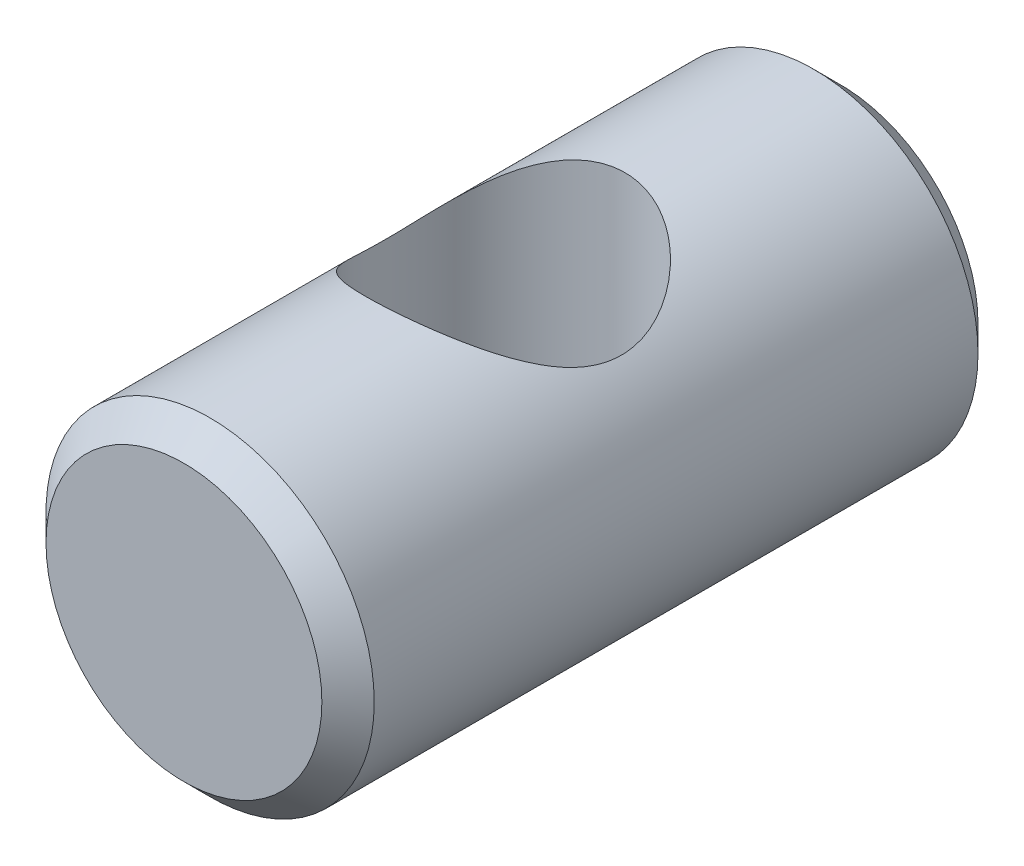
ISO-10303-21;
HEADER;
FILE_DESCRIPTION(('STEP AP214'),'2;1');
FILE_NAME('part.step','',(''),(''),'','','');
FILE_SCHEMA(('AUTOMOTIVE_DESIGN { 1 0 10303 214 1 1 1 1 }'));
ENDSEC;
DATA;
#1=APPLICATION_CONTEXT('core data for automotive mechanical design processes');
#2=APPLICATION_PROTOCOL_DEFINITION('international standard','automotive_design',2000,#1);
#3=PRODUCT_CONTEXT('',#1,'mechanical');
#4=PRODUCT('Part','Part','',(#3));
#5=PRODUCT_RELATED_PRODUCT_CATEGORY('part','',(#4));
#6=PRODUCT_DEFINITION_FORMATION('','',#4);
#7=PRODUCT_DEFINITION_CONTEXT('part definition',#1,'design');
#8=PRODUCT_DEFINITION('design','',#6,#7);
#9=PRODUCT_DEFINITION_SHAPE('','',#8);
#10=(LENGTH_UNIT() NAMED_UNIT(*) SI_UNIT(.MILLI.,.METRE.));
#11=(NAMED_UNIT(*) PLANE_ANGLE_UNIT() SI_UNIT($,.RADIAN.));
#12=(NAMED_UNIT(*) SI_UNIT($,.STERADIAN.) SOLID_ANGLE_UNIT());
#13=UNCERTAINTY_MEASURE_WITH_UNIT(LENGTH_MEASURE(1.E-05),#10,'distance_accuracy_value','');
#14=(GEOMETRIC_REPRESENTATION_CONTEXT(3) GLOBAL_UNCERTAINTY_ASSIGNED_CONTEXT((#13)) GLOBAL_UNIT_ASSIGNED_CONTEXT((#10,
#11,#12)) REPRESENTATION_CONTEXT('',''));
#15=CARTESIAN_POINT('',(0.,0.,0.));
#16=DIRECTION('',(0.,0.,1.));
#17=DIRECTION('',(1.,0.,0.));
#18=AXIS2_PLACEMENT_3D('',#15,#16,#17);
#19=CARTESIAN_POINT('',(0.,0.,9.525));
#20=DIRECTION('',(0.,0.,-1.));
#21=DIRECTION('',(-1.,0.,0.));
#22=AXIS2_PLACEMENT_3D('',#19,#20,#21);
#23=CYLINDRICAL_SURFACE('',#22,4.765);
#24=CARTESIAN_POINT('',(0.,0.,8.76500000000001));
#25=DIRECTION('',(0.,0.,1.));
#26=DIRECTION('',(1.,0.,0.));
#27=AXIS2_PLACEMENT_3D('',#24,#25,#26);
#28=CIRCLE('',#27,4.765);
#29=CARTESIAN_POINT('',(4.765,0.,8.76500000000001));
#30=VERTEX_POINT('',#29);
#31=EDGE_CURVE('E45',#30,#30,#28,.F.);
#32=ORIENTED_EDGE('',*,*,#31,.T.);
#33=EDGE_LOOP('',(#32));
#34=FACE_BOUND('',#33,.T.);
#35=CARTESIAN_POINT('',(0.,0.,-8.76499999999999));
#36=DIRECTION('',(0.,0.,1.));
#37=DIRECTION('',(1.,0.,0.));
#38=AXIS2_PLACEMENT_3D('',#35,#36,#37);
#39=CIRCLE('',#38,4.765);
#40=CARTESIAN_POINT('',(4.765,0.,-8.76499999999999));
#41=VERTEX_POINT('',#40);
#42=EDGE_CURVE('E49',#41,#41,#39,.T.);
#43=ORIENTED_EDGE('',*,*,#42,.T.);
#44=EDGE_LOOP('',(#43));
#45=FACE_BOUND('',#44,.T.);
#46=CARTESIAN_POINT('',(0.,-4.765,-3.42087708051605));
#47=CARTESIAN_POINT('',(-0.0833627581168181,-4.7649997101109,-3.42696899134863));
#48=CARTESIAN_POINT('',(-0.166953392424251,-4.76280757869707,-3.43001003086424));
#49=CARTESIAN_POINT('',(-0.333933182408652,-4.75402028790231,-3.4299899120654));
#50=CARTESIAN_POINT('',(-0.41732223719261,-4.74742325494959,-3.42692615604904));
#51=CARTESIAN_POINT('',(-0.583312250165056,-4.72989865727235,-3.41478160746824));
#52=CARTESIAN_POINT('',(-0.665912068503747,-4.71896558414041,-3.40569315136156));
#53=CARTESIAN_POINT('',(-0.829610597514772,-4.69295834085159,-3.38168739143667));
#54=CARTESIAN_POINT('',(-0.91070865358331,-4.67788240819801,-3.36676760565251));
#55=CARTESIAN_POINT('',(-1.15000632689336,-4.62699847385246,-3.31382161536754));
#56=CARTESIAN_POINT('',(-1.30524951697123,-4.58542013528299,-3.26752778272676));
#57=CARTESIAN_POINT('',(-1.60411463212557,-4.48962808746058,-3.15544383432779));
#58=CARTESIAN_POINT('',(-1.74773682156028,-4.43541466574349,-3.08965416222603));
#59=CARTESIAN_POINT('',(-2.03259497643689,-4.31273538578719,-2.93522566350036));
#60=CARTESIAN_POINT('',(-2.17272279857911,-4.24347672491827,-2.84518090003159));
#61=CARTESIAN_POINT('',(-2.43631552731587,-4.09784606286129,-2.64803347355049));
#62=CARTESIAN_POINT('',(-2.55976291960052,-4.02146672501527,-2.54091313456509));
#63=CARTESIAN_POINT('',(-2.81327393100644,-3.84950291536883,-2.28757037498761));
#64=CARTESIAN_POINT('',(-2.93940806717613,-3.75321839663728,-2.13784494064544));
#65=CARTESIAN_POINT('',(-3.10885207016274,-3.61188607024724,-1.89774924473951));
#66=CARTESIAN_POINT('',(-3.16205944901992,-3.56527135977744,-1.81509327318893));
#67=CARTESIAN_POINT('',(-3.26165283895997,-3.47438917550769,-1.64456461914389));
#68=CARTESIAN_POINT('',(-3.30804141803447,-3.43012082209569,-1.55669391813204));
#69=CARTESIAN_POINT('',(-3.41144333221737,-3.32784018306176,-1.33801732923479));
#70=CARTESIAN_POINT('',(-3.46485738281701,-3.27176419567389,-1.20454764001565));
#71=CARTESIAN_POINT('',(-3.55539465585279,-3.1731532714438,-0.92756721927326));
#72=CARTESIAN_POINT('',(-3.59255605597934,-3.13058666617785,-0.784080947165173));
#73=CARTESIAN_POINT('',(-3.64343651296181,-3.07113542283653,-0.514646140223209));
#74=CARTESIAN_POINT('',(-3.66010628533956,-3.05107413064414,-0.389980532152303));
#75=CARTESIAN_POINT('',(-3.67954153570878,-3.02761567970702,-0.13805144197163));
#76=CARTESIAN_POINT('',(-3.68232117171679,-3.02420155283186,-0.0107907379518655));
#77=CARTESIAN_POINT('',(-3.67376621747767,-3.03458366659267,0.242449329866106));
#78=CARTESIAN_POINT('',(-3.66243797397314,-3.04837216824954,0.368429244158408));
#79=CARTESIAN_POINT('',(-3.62657095184853,-3.09094772918142,0.615927376424316));
#80=CARTESIAN_POINT('',(-3.60201250089043,-3.11975712134959,0.737438661719832));
#81=CARTESIAN_POINT('',(-3.52797021750045,-3.20358122773375,1.02486117239319));
#82=CARTESIAN_POINT('',(-3.47231020523667,-3.26453704351351,1.18741075414518));
#83=CARTESIAN_POINT('',(-3.34017866781708,-3.39961296516166,1.498121783823));
#84=CARTESIAN_POINT('',(-3.2636446149314,-3.47377238661047,1.64623815847782));
#85=CARTESIAN_POINT('',(-3.12200897105521,-3.60054284241464,1.87825971607124));
#86=CARTESIAN_POINT('',(-3.06234750531042,-3.65156363596669,1.9664324955114));
#87=CARTESIAN_POINT('',(-2.93536296354977,-3.75440484501345,2.13658829521524));
#88=CARTESIAN_POINT('',(-2.86803758566651,-3.80622549668558,2.21856944344932));
#89=CARTESIAN_POINT('',(-2.65493557738645,-3.96070606463684,2.4548169203279));
#90=CARTESIAN_POINT('',(-2.4978237985218,-4.06258137631192,2.59972905493882));
#91=CARTESIAN_POINT('',(-2.18575837138569,-4.23718725327564,2.83706621766583));
#92=CARTESIAN_POINT('',(-2.03548298499758,-4.31186637762032,2.93424360521689));
#93=CARTESIAN_POINT('',(-1.71702572980925,-4.44824656330391,3.10568912436018));
#94=CARTESIAN_POINT('',(-1.54887024912961,-4.50996636079323,3.17999040299218));
#95=CARTESIAN_POINT('',(-1.22389848309853,-4.60778480850806,3.29263516387729));
#96=CARTESIAN_POINT('',(-1.06910753325384,-4.64632732736096,3.33468022800881));
#97=CARTESIAN_POINT('',(-0.752190984217971,-4.70801774696666,3.39687013419293));
#98=CARTESIAN_POINT('',(-0.590069112764688,-4.73117337991453,3.4170259792185));
#99=CARTESIAN_POINT('',(-0.262598143568304,-4.7606051003247,3.43390286080124));
#100=CARTESIAN_POINT('',(-0.0972412962651654,-4.76683385814853,3.43055828056669));
#101=CARTESIAN_POINT('',(0.231024129353291,-4.76222706928004,3.40010195996678));
#102=CARTESIAN_POINT('',(0.393932420256084,-4.75138953488968,3.37298745129903));
#103=CARTESIAN_POINT('',(0.705514268669747,-4.71498049061455,3.2979508357131));
#104=CARTESIAN_POINT('',(0.854498752183593,-4.69006694126301,3.25098003249397));
#105=CARTESIAN_POINT('',(1.14256413370517,-4.62833634686259,3.13840780618742));
#106=CARTESIAN_POINT('',(1.28164310390504,-4.59151699239254,3.07280276883643));
#107=CARTESIAN_POINT('',(1.5605913242394,-4.50478911028579,2.91796402171938));
#108=CARTESIAN_POINT('',(1.6992420339739,-4.45396042558585,2.82706121692328));
#109=CARTESIAN_POINT('',(1.96045324775841,-4.34533105232054,2.62789389216064));
#110=CARTESIAN_POINT('',(2.08299871660834,-4.28752394420402,2.51961335554432));
#111=CARTESIAN_POINT('',(2.33061071233595,-4.15886196775128,2.26753986981794));
#112=CARTESIAN_POINT('',(2.45245602746959,-4.08747815085455,2.12084350362776));
#113=CARTESIAN_POINT('',(2.67091966387116,-3.94818744226299,1.80818256348861));
#114=CARTESIAN_POINT('',(2.76753692468301,-3.88028069682256,1.64221717999394));
#115=CARTESIAN_POINT('',(2.91829752704228,-3.76775877390235,1.32363316444147));
#116=CARTESIAN_POINT('',(2.97693831230802,-3.72114907301219,1.17388770573105));
#117=CARTESIAN_POINT('',(3.04915600293589,-3.66180847873486,0.941826581338293));
#118=CARTESIAN_POINT('',(3.0706008978109,-3.64379412637323,0.863255129060434));
#119=CARTESIAN_POINT('',(3.10797188341904,-3.61197174564401,0.703992654043788));
#120=CARTESIAN_POINT('',(3.12390068817333,-3.59816164910817,0.623302694735672));
#121=CARTESIAN_POINT('',(3.15010468685879,-3.57524455910332,0.459495462666018));
#122=CARTESIAN_POINT('',(3.16032158062367,-3.5661861203942,0.376361962516616));
#123=CARTESIAN_POINT('',(3.17464168800661,-3.55344451616001,0.209195138832912));
#124=CARTESIAN_POINT('',(3.17874788699032,-3.54975872585817,0.125162274904956));
#125=CARTESIAN_POINT('',(3.18076053743013,-3.54795587812489,-0.0430393452037649));
#126=CARTESIAN_POINT('',(3.17866722999484,-3.54983860412504,-0.127208095972433));
#127=CARTESIAN_POINT('',(3.16833758034576,-3.55905933774995,-0.294840628996076));
#128=CARTESIAN_POINT('',(3.16010150131517,-3.56639711165655,-0.378304441298765));
#129=CARTESIAN_POINT('',(3.129430196119,-3.59341005189328,-0.604314657609784));
#130=CARTESIAN_POINT('',(3.10101793603989,-3.61818171011667,-0.745494317394035));
#131=CARTESIAN_POINT('',(3.02771937958645,-3.67972750014127,-1.02069983126741));
#132=CARTESIAN_POINT('',(2.98281650470617,-3.71651370639189,-1.1547183301723));
#133=CARTESIAN_POINT('',(2.8560768918245,-3.8153502491925,-1.46853642894096));
#134=CARTESIAN_POINT('',(2.76664814536404,-3.88152734494911,-1.64398166227299));
#135=CARTESIAN_POINT('',(2.56077346334119,-4.02033820070584,-1.97551522842484));
#136=CARTESIAN_POINT('',(2.44428083509274,-4.09298298410994,-2.13156938380249));
#137=CARTESIAN_POINT('',(2.18450650401399,-4.2373970566927,-2.42421216807333));
#138=CARTESIAN_POINT('',(2.04090097393914,-4.30914323590253,-2.56052605726515));
#139=CARTESIAN_POINT('',(1.72973058522059,-4.44318432752426,-2.80802181758102));
#140=CARTESIAN_POINT('',(1.56219804304704,-4.50549175797245,-2.91923707314102));
#141=CARTESIAN_POINT('',(1.23969583506405,-4.60338031575656,-3.09396462152008));
#142=CARTESIAN_POINT('',(1.08834922542924,-4.64178783933997,-3.16252149709775));
#143=CARTESIAN_POINT('',(0.85338781071092,-4.68864069192958,-3.24875451241662));
#144=CARTESIAN_POINT('',(0.773800863355168,-4.70245945854321,-3.27471971164357));
#145=CARTESIAN_POINT('',(0.612411306870997,-4.72618391319332,-3.32087000112459));
#146=CARTESIAN_POINT('',(0.530609679466058,-4.73609130567107,-3.34105760799584));
#147=CARTESIAN_POINT('',(0.374335243630177,-4.75084997254152,-3.37353939001354));
#148=CARTESIAN_POINT('',(0.300030947704158,-4.75613339853629,-3.38645258471521));
#149=CARTESIAN_POINT('',(0.150546671086999,-4.76320900575073,-3.40736829831093));
#150=CARTESIAN_POINT('',(0.0753664637160969,-4.76500026208246,-3.41536951590209));
#151=CARTESIAN_POINT('',(0.,-4.765,-3.42087708051605));
#152=B_SPLINE_CURVE_WITH_KNOTS('',3,(#46,#47,#48,#49,#50,#51,#52,#53,#54,#55,#56,#57,#58,#59,
#60,#61,#62,#63,#64,#65,#66,#67,#68,#69,#70,#71,#72,#73,#74,#75,#76,#77,#78,#79,#80,#81,#82,#83,
#84,#85,#86,#87,#88,#89,#90,#91,#92,#93,#94,#95,#96,#97,#98,#99,#100,#101,#102,#103,#104,#105,
#106,#107,#108,#109,#110,#111,#112,#113,#114,#115,#116,#117,#118,#119,#120,#121,#122,#123,#124,
#125,#126,#127,#128,#129,#130,#131,#132,#133,#134,#135,#136,#137,#138,#139,#140,#141,#142,#143,
#144,#145,#146,#147,#148,#149,#150,#151),.UNSPECIFIED.,.T.,.F.,(4,2,2,2,2,2,2,2,2,2,2,2,2,2,2,2,
2,2,2,2,2,2,2,2,2,2,2,2,2,2,2,2,2,2,2,2,2,2,2,2,2,2,2,2,2,2,2,2,2,2,2,2,4),(0.,
0.250678148817341,0.501462988541287,0.752567445437252,1.00377889552888,1.50309474088369,
2.00239922444642,2.54160992918404,3.08138247258981,3.73300244855075,4.05909733145616,
4.38506908912952,4.84654436743379,5.30692973453839,5.68734604359481,6.06737452056514,
6.44723209503533,6.82765605484285,7.37157480546313,7.91714109472133,8.27090631470675,
8.62477807035776,9.33119791439566,9.91077027397039,10.4894988486046,10.9822712500665,
11.4747958366297,11.9686961727678,12.4626540373564,12.9352342359093,13.4079061579591,
13.9261848288361,14.4449439577642,15.0533142145202,15.6617100398796,16.1619385675779,
16.4119146790501,16.6617676221917,16.9141262556176,17.1663615593023,17.4185870532858,
17.6708017414467,18.1072101440206,18.5440584873629,19.1640002904501,19.7850197135797,
20.4139885307568,21.0421157411608,21.5513660687497,21.8056438515067,22.059810706191,
22.2863833912941,22.5130160751694),.UNSPECIFIED.);
#153=CARTESIAN_POINT('',(0.,-4.765,-3.42087708051605));
#154=VERTEX_POINT('',#153);
#155=EDGE_CURVE('E58',#154,#154,#152,.T.);
#156=ORIENTED_EDGE('',*,*,#155,.T.);
#157=EDGE_LOOP('',(#156));
#158=FACE_BOUND('',#157,.T.);
#159=CARTESIAN_POINT('',(-0.25,4.75843724346555,3.43));
#160=CARTESIAN_POINT('',(-0.422180009069406,4.749390618167,3.42999980483541));
#161=CARTESIAN_POINT('',(-0.59386282730199,4.73091871113112,3.41695856293195));
#162=CARTESIAN_POINT('',(-0.930629104770302,4.67635636796384,3.36610979440147));
#163=CARTESIAN_POINT('',(-1.09570851357914,4.64025529237457,3.32828730721862));
#164=CARTESIAN_POINT('',(-1.41392411864396,4.55336447971862,3.23075051942857));
#165=CARTESIAN_POINT('',(-1.56712334101048,4.5026601113221,3.17116292636266));
#166=CARTESIAN_POINT('',(-1.85998836726663,4.38979766700268,3.03299834240104));
#167=CARTESIAN_POINT('',(-1.99965414606241,4.32763956984278,2.95442131629586));
#168=CARTESIAN_POINT('',(-2.27820698899914,4.18828982189439,2.77162910883962));
#169=CARTESIAN_POINT('',(-2.41542819149111,4.11020218068904,2.66557505303866));
#170=CARTESIAN_POINT('',(-2.67111072919315,3.94883137284482,2.43572487373919));
#171=CARTESIAN_POINT('',(-2.78953546002451,3.86553849846079,2.31189500490524));
#172=CARTESIAN_POINT('',(-2.96344629098398,3.732292646302,2.10063521621267));
#173=CARTESIAN_POINT('',(-3.02522112465854,3.68226630299909,2.01833701427756));
#174=CARTESIAN_POINT('',(-3.14150590868554,3.58357003530251,1.84790207991889));
#175=CARTESIAN_POINT('',(-3.1960131207988,3.5349006275963,1.7597631654945));
#176=CARTESIAN_POINT('',(-3.29731229261899,3.44060115304685,1.57784833521895));
#177=CARTESIAN_POINT('',(-3.34411822611588,3.39496567295495,1.48408305992192));
#178=CARTESIAN_POINT('',(-3.42959137880208,3.30859742398812,1.29083456033672));
#179=CARTESIAN_POINT('',(-3.46826509160405,3.2678607546062,1.19135597958454));
#180=CARTESIAN_POINT('',(-3.54347659526858,3.18632211811376,0.966712328692861));
#181=CARTESIAN_POINT('',(-3.57812346664731,3.14705996480953,0.840323998552468));
#182=CARTESIAN_POINT('',(-3.63302442402354,3.08352956814293,0.580976208361932));
#183=CARTESIAN_POINT('',(-3.65331272726122,3.05922569654856,0.448033183521057));
#184=CARTESIAN_POINT('',(-3.67812283683354,3.02936636632518,0.177337549423231));
#185=CARTESIAN_POINT('',(-3.68251233934075,3.02396824643502,0.0395541719109347));
#186=CARTESIAN_POINT('',(-3.67470644643728,3.03344305810687,-0.234875874606968));
#187=CARTESIAN_POINT('',(-3.66249943392474,3.04833018879986,-0.37152167996018));
#188=CARTESIAN_POINT('',(-3.62015799382368,3.09852315491188,-0.655828380639309));
#189=CARTESIAN_POINT('',(-3.58799174144691,3.13612809889826,-0.802759414360211));
#190=CARTESIAN_POINT('',(-3.50660899556505,3.22685391573891,-1.08690765852793));
#191=CARTESIAN_POINT('',(-3.45734815065714,3.28001509196861,-1.22409847190397));
#192=CARTESIAN_POINT('',(-3.35999029035731,3.37921222953507,-1.45031682658415));
#193=CARTESIAN_POINT('',(-3.31552748835515,3.42299124550292,-1.54196683547208));
#194=CARTESIAN_POINT('',(-3.21937168211258,3.51357799533849,-1.7198719105116));
#195=CARTESIAN_POINT('',(-3.16767569861283,3.56038697291961,-1.80612473233373));
#196=CARTESIAN_POINT('',(-3.05733519065029,3.655577234441,-1.97327341136436));
#197=CARTESIAN_POINT('',(-2.99868376029761,3.70396004583247,-2.05416381804875));
#198=CARTESIAN_POINT('',(-2.87465956601933,3.80102084509467,-2.21043246978884));
#199=CARTESIAN_POINT('',(-2.80928649472037,3.84969884636825,-2.28581046249783));
#200=CARTESIAN_POINT('',(-2.6702557671566,3.94744940552613,-2.43263894546763));
#201=CARTESIAN_POINT('',(-2.59643405525365,3.99650228404323,-2.50394748039488));
#202=CARTESIAN_POINT('',(-2.44198609531555,4.09270177982323,-2.64020867362414));
#203=CARTESIAN_POINT('',(-2.36135999487914,4.13984843840247,-2.70516146972696));
#204=CARTESIAN_POINT('',(-2.19361254846785,4.2311207520192,-2.82808330517596));
#205=CARTESIAN_POINT('',(-2.10650409604225,4.27525208591359,-2.88606563800173));
#206=CARTESIAN_POINT('',(-1.92594548966524,4.3595756679867,-2.99452956360935));
#207=CARTESIAN_POINT('',(-1.8324951446076,4.39976779737236,-3.04501093021117));
#208=CARTESIAN_POINT('',(-1.58991791011193,4.49465680101692,-3.16160717844564));
#209=CARTESIAN_POINT('',(-1.43688887677842,4.54617300319559,-3.22239703143537));
#210=CARTESIAN_POINT('',(-1.11985321098478,4.63445714602499,-3.3220213557935));
#211=CARTESIAN_POINT('',(-0.955854490731875,4.67123558567514,-3.36087146486794));
#212=CARTESIAN_POINT('',(-0.620041304864638,4.72756501903715,-3.41423360193657));
#213=CARTESIAN_POINT('',(-0.448189976813925,4.74702354164412,-3.42861536060857));
#214=CARTESIAN_POINT('',(-0.10319553205656,4.76701209164517,-3.43119218349009));
#215=CARTESIAN_POINT('',(0.069947271391446,4.76754656888776,-3.41939340455174));
#216=CARTESIAN_POINT('',(0.396800733953032,4.75102741592386,-3.37216085402572));
#217=CARTESIAN_POINT('',(0.550903795546911,4.73547935394817,-3.33884247322146));
#218=CARTESIAN_POINT('',(0.851262679297079,4.69080460019725,-3.25216372524372));
#219=CARTESIAN_POINT('',(0.997516834516369,4.66167503663273,-3.19879911978834));
#220=CARTESIAN_POINT('',(1.28614476637547,4.59066745677348,-3.07104032256261));
#221=CARTESIAN_POINT('',(1.42797966766526,4.5482360225696,-2.99574591149817));
#222=CARTESIAN_POINT('',(1.69771873358212,4.45459184021555,-2.82781924377908));
#223=CARTESIAN_POINT('',(1.82561916137349,4.40337674596602,-2.73518235437366));
#224=CARTESIAN_POINT('',(2.08559098582612,4.28706511495821,-2.51852707855975));
#225=CARTESIAN_POINT('',(2.2150420244168,4.22105957781513,-2.39185853378127));
#226=CARTESIAN_POINT('',(2.4525288591269,4.08765163666692,-2.119882962336));
#227=CARTESIAN_POINT('',(2.56051870491994,4.02024656957631,-1.97453701758847));
#228=CARTESIAN_POINT('',(2.71141297716131,3.91890470250436,-1.73364032653499));
#229=CARTESIAN_POINT('',(2.76225962831151,3.88310759046258,-1.64375989611527));
#230=CARTESIAN_POINT('',(2.85606768069206,3.81463871939836,-1.45876664530863));
#231=CARTESIAN_POINT('',(2.8990272649147,3.78196768138303,-1.36365262576039));
#232=CARTESIAN_POINT('',(2.97638382467227,3.7213945324715,-1.16888238761678));
#233=CARTESIAN_POINT('',(3.01080676435227,3.6934780438477,-1.06924106056856));
#234=CARTESIAN_POINT('',(3.07061216797024,3.64390866973889,-0.865836413850732));
#235=CARTESIAN_POINT('',(3.09600079900905,3.62225151334222,-0.762075960014793));
#236=CARTESIAN_POINT('',(3.14431905107756,3.58048576732931,-0.51427610984992));
#237=CARTESIAN_POINT('',(3.1632690781055,3.56357947310397,-0.36886387726438));
#238=CARTESIAN_POINT('',(3.18229415057448,3.54660528363273,-0.0759553160984843));
#239=CARTESIAN_POINT('',(3.18238833621043,3.54652031339164,0.0715387471135818));
#240=CARTESIAN_POINT('',(3.16376347579515,3.56313911837427,0.36412784346974));
#241=CARTESIAN_POINT('',(3.14506985693007,3.57982020262542,0.509225849632981));
#242=CARTESIAN_POINT('',(3.09006178812863,3.6274007096972,0.793694678976364));
#243=CARTESIAN_POINT('',(3.05372153995533,3.65832094581284,0.933056792070445));
#244=CARTESIAN_POINT('',(2.94995679839854,3.74283457822027,1.249627259653));
#245=CARTESIAN_POINT('',(2.87616913174531,3.80056128592335,1.42363336901504));
#246=CARTESIAN_POINT('',(2.70309172031867,3.9255469405295,1.75476054116614));
#247=CARTESIAN_POINT('',(2.60375916203549,3.99282180458683,1.91185262262683));
#248=CARTESIAN_POINT('',(2.37965965281677,4.13038218124549,2.21024978907531));
#249=CARTESIAN_POINT('',(2.25446848393284,4.20070005001654,2.35122119961121));
#250=CARTESIAN_POINT('',(1.98132226028618,4.33621841215064,2.61183089931648));
#251=CARTESIAN_POINT('',(1.83339056066265,4.40142405331531,2.73149080683867));
#252=CARTESIAN_POINT('',(1.53413492006617,4.51378899534322,2.93439863762912));
#253=CARTESIAN_POINT('',(1.38501302638156,4.56214832085995,3.02021473285691));
#254=CARTESIAN_POINT('',(1.07249564524745,4.64554146755817,3.16951406225263));
#255=CARTESIAN_POINT('',(0.909111289256103,4.68058556855773,3.23301452201411));
#256=CARTESIAN_POINT('',(0.581478494873657,4.73212589223905,3.33183530764178));
#257=CARTESIAN_POINT('',(0.417802064196769,4.74955942472212,3.36854686433097));
#258=CARTESIAN_POINT('',(0.0859254534274418,4.76711849433294,3.41762518536938));
#259=CARTESIAN_POINT('',(-0.0822731758795955,4.76724989098796,3.43000019011695));
#260=CARTESIAN_POINT('',(-0.25,4.75843724346555,3.43));
#261=B_SPLINE_CURVE_WITH_KNOTS('',3,(#159,#160,#161,#162,#163,#164,#165,#166,#167,#168,#169,
#170,#171,#172,#173,#174,#175,#176,#177,#178,#179,#180,#181,#182,#183,#184,#185,#186,#187,#188,
#189,#190,#191,#192,#193,#194,#195,#196,#197,#198,#199,#200,#201,#202,#203,#204,#205,#206,#207,
#208,#209,#210,#211,#212,#213,#214,#215,#216,#217,#218,#219,#220,#221,#222,#223,#224,#225,#226,
#227,#228,#229,#230,#231,#232,#233,#234,#235,#236,#237,#238,#239,#240,#241,#242,#243,#244,#245,
#246,#247,#248,#249,#250,#251,#252,#253,#254,#255,#256,#257,#258,#259,#260),.UNSPECIFIED.,.T.,
.F.,(4,2,2,2,2,2,2,2,2,2,2,2,2,2,2,2,2,2,2,2,2,2,2,2,2,2,2,2,2,2,2,2,2,2,2,2,2,2,2,2,2,2,2,2,2,
2,2,2,2,2,4),(0.,0.516551025096824,1.03341418220019,1.54731512007828,2.06121701081903,
2.62982932183038,3.19953571462131,3.54246459279583,3.88552231417978,4.22795053195655,
4.57010427222594,4.97905439316964,5.38702665221778,5.79838620186915,6.21003384012951,
6.67262967068467,7.1364347778277,7.46866532411958,7.80103311718076,8.13373371721725,
8.46644953806418,8.80733809568013,9.14821926074384,9.48843965067855,9.82867029735156,
10.3440014803113,10.8589648922706,11.3766614843259,11.8942363430695,12.3673901670618,
12.8406440841658,13.3370245096255,13.8335377244494,14.4096746680997,14.9870321881218,
15.3145391492316,15.6421214663625,15.968694875667,16.2950449261748,16.7357599059526,
17.1760275223247,17.6157000871626,18.0560173690192,18.6457302885718,19.2364380888803,
19.8377403374759,20.4384291081866,20.9723943239786,21.5059464582794,22.0093081125728,
22.5124992983782),.UNSPECIFIED.);
#262=CARTESIAN_POINT('',(-0.25,4.75843724346555,3.43));
#263=VERTEX_POINT('',#262);
#264=EDGE_CURVE('E66',#263,#263,#261,.T.);
#265=ORIENTED_EDGE('',*,*,#264,.T.);
#266=EDGE_LOOP('',(#265));
#267=FACE_BOUND('',#266,.T.);
#268=ADVANCED_FACE('F37',(#34,#45,#158,#267),#23,.T.);
#269=CARTESIAN_POINT('',(0.,0.,9.525));
#270=DIRECTION('',(0.,0.,1.));
#271=DIRECTION('',(1.,0.,0.));
#272=AXIS2_PLACEMENT_3D('',#269,#270,#271);
#273=PLANE('',#272);
#274=CARTESIAN_POINT('',(0.,0.,9.525));
#275=DIRECTION('',(0.,0.,1.));
#276=DIRECTION('',(1.,0.,0.));
#277=AXIS2_PLACEMENT_3D('',#274,#275,#276);
#278=CIRCLE('',#277,4.00500000000001);
#279=CARTESIAN_POINT('',(4.00500000000001,0.,9.525));
#280=VERTEX_POINT('',#279);
#281=EDGE_CURVE('E53',#280,#280,#278,.T.);
#282=ORIENTED_EDGE('',*,*,#281,.T.);
#283=EDGE_LOOP('',(#282));
#284=FACE_BOUND('',#283,.T.);
#285=ADVANCED_FACE('F79',(#284),#273,.T.);
#286=CARTESIAN_POINT('',(0.,0.,-9.525));
#287=DIRECTION('',(0.,0.,1.));
#288=DIRECTION('',(1.,0.,0.));
#289=AXIS2_PLACEMENT_3D('',#286,#287,#288);
#290=PLANE('',#289);
#291=CARTESIAN_POINT('',(0.,0.,-9.525));
#292=DIRECTION('',(0.,0.,1.));
#293=DIRECTION('',(1.,0.,0.));
#294=AXIS2_PLACEMENT_3D('',#291,#292,#293);
#295=CIRCLE('',#294,4.00499999999998);
#296=CARTESIAN_POINT('',(4.00499999999998,0.,-9.525));
#297=VERTEX_POINT('',#296);
#298=EDGE_CURVE('E10',#297,#297,#295,.F.);
#299=ORIENTED_EDGE('',*,*,#298,.T.);
#300=EDGE_LOOP('',(#299));
#301=FACE_BOUND('',#300,.T.);
#302=ADVANCED_FACE('F77',(#301),#290,.F.);
#303=CARTESIAN_POINT('',(-0.25,-4.765,0.));
#304=DIRECTION('',(0.,1.,0.));
#305=DIRECTION('',(0.,0.,1.));
#306=AXIS2_PLACEMENT_3D('',#303,#304,#305);
#307=CYLINDRICAL_SURFACE('',#306,3.43);
#308=ORIENTED_EDGE('',*,*,#264,.F.);
#309=EDGE_LOOP('',(#308));
#310=FACE_BOUND('',#309,.T.);
#311=ORIENTED_EDGE('',*,*,#155,.F.);
#312=EDGE_LOOP('',(#311));
#313=FACE_BOUND('',#312,.T.);
#314=ADVANCED_FACE('F72',(#310,#313),#307,.F.);
#315=CARTESIAN_POINT('',(0.,0.,9.525));
#316=DIRECTION('',(0.,0.,-1.));
#317=DIRECTION('',(-1.,0.,0.));
#318=AXIS2_PLACEMENT_3D('',#315,#316,#317);
#319=CONICAL_SURFACE('',#318,4.00500000000001,0.785398163397448);
#320=ORIENTED_EDGE('',*,*,#31,.F.);
#321=EDGE_LOOP('',(#320));
#322=FACE_BOUND('',#321,.T.);
#323=ORIENTED_EDGE('',*,*,#281,.F.);
#324=EDGE_LOOP('',(#323));
#325=FACE_BOUND('',#324,.T.);
#326=ADVANCED_FACE('F76',(#322,#325),#319,.T.);
#327=CARTESIAN_POINT('',(0.,0.,-8.76499999999999));
#328=DIRECTION('',(0.,0.,1.));
#329=DIRECTION('',(1.,0.,0.));
#330=AXIS2_PLACEMENT_3D('',#327,#328,#329);
#331=CONICAL_SURFACE('',#330,4.765,0.785398163397451);
#332=ORIENTED_EDGE('',*,*,#298,.F.);
#333=EDGE_LOOP('',(#332));
#334=FACE_BOUND('',#333,.T.);
#335=ORIENTED_EDGE('',*,*,#42,.F.);
#336=EDGE_LOOP('',(#335));
#337=FACE_BOUND('',#336,.T.);
#338=ADVANCED_FACE('F40',(#334,#337),#331,.T.);
#339=CLOSED_SHELL('',(#268,#285,#302,#314,#326,#338));
#340=MANIFOLD_SOLID_BREP('B2',#339);
#341=ADVANCED_BREP_SHAPE_REPRESENTATION('',(#18,#340),#14);
#342=SHAPE_DEFINITION_REPRESENTATION(#9,#341);
ENDSEC;
END-ISO-10303-21;
